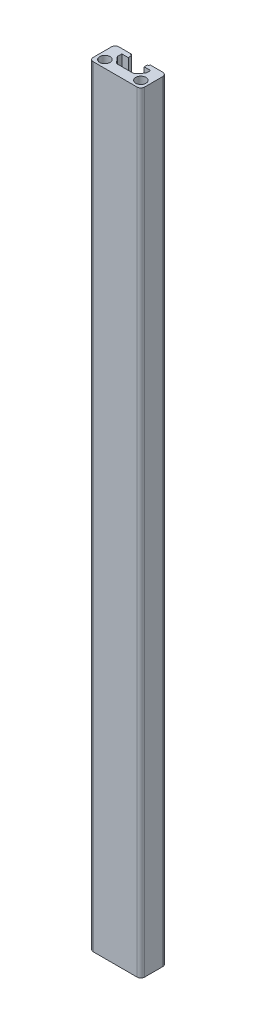
ISO-10303-21;
HEADER;
FILE_DESCRIPTION(('STEP AP214'),'2;1');
FILE_NAME('part.step','',(''),(''),'','','');
FILE_SCHEMA(('AUTOMOTIVE_DESIGN { 1 0 10303 214 1 1 1 1 }'));
ENDSEC;
DATA;
#1=APPLICATION_CONTEXT('core data for automotive mechanical design processes');
#2=APPLICATION_PROTOCOL_DEFINITION('international standard','automotive_design',2000,#1);
#3=PRODUCT_CONTEXT('',#1,'mechanical');
#4=PRODUCT('Part','Part','',(#3));
#5=PRODUCT_RELATED_PRODUCT_CATEGORY('part','',(#4));
#6=PRODUCT_DEFINITION_FORMATION('','',#4);
#7=PRODUCT_DEFINITION_CONTEXT('part definition',#1,'design');
#8=PRODUCT_DEFINITION('design','',#6,#7);
#9=PRODUCT_DEFINITION_SHAPE('','',#8);
#10=(LENGTH_UNIT() NAMED_UNIT(*) SI_UNIT(.MILLI.,.METRE.));
#11=(NAMED_UNIT(*) PLANE_ANGLE_UNIT() SI_UNIT($,.RADIAN.));
#12=(NAMED_UNIT(*) SI_UNIT($,.STERADIAN.) SOLID_ANGLE_UNIT());
#13=UNCERTAINTY_MEASURE_WITH_UNIT(LENGTH_MEASURE(1.E-05),#10,'distance_accuracy_value','');
#14=(GEOMETRIC_REPRESENTATION_CONTEXT(3) GLOBAL_UNCERTAINTY_ASSIGNED_CONTEXT((#13)) GLOBAL_UNIT_ASSIGNED_CONTEXT((#10,
#11,#12)) REPRESENTATION_CONTEXT('',''));
#15=CARTESIAN_POINT('',(0.,0.,0.));
#16=DIRECTION('',(0.,0.,1.));
#17=DIRECTION('',(1.,0.,0.));
#18=AXIS2_PLACEMENT_3D('',#15,#16,#17);
#19=CARTESIAN_POINT('',(0.,300.,0.));
#20=DIRECTION('',(0.,1.,0.));
#21=DIRECTION('',(0.,0.,1.));
#22=AXIS2_PLACEMENT_3D('',#19,#20,#21);
#23=PLANE('',#22);
#24=CARTESIAN_POINT('',(17.,300.,-3.));
#25=DIRECTION('',(0.,1.,0.));
#26=DIRECTION('',(0.,0.,1.));
#27=AXIS2_PLACEMENT_3D('',#24,#25,#26);
#28=CIRCLE('',#27,2.);
#29=CARTESIAN_POINT('',(17.,300.,-0.999999999999997));
#30=VERTEX_POINT('',#29);
#31=EDGE_CURVE('E241',#30,#30,#28,.T.);
#32=ORIENTED_EDGE('',*,*,#31,.F.);
#33=EDGE_LOOP('',(#32));
#34=FACE_BOUND('',#33,.T.);
#35=DIRECTION('',(-1.,0.,0.));
#36=VECTOR('',#35,1.);
#37=CARTESIAN_POINT('',(6.35,300.,-10.));
#38=LINE('',#37,#36);
#39=CARTESIAN_POINT('',(6.35,300.,-10.));
#40=VERTEX_POINT('',#39);
#41=CARTESIAN_POINT('',(1.5,300.,-10.));
#42=VERTEX_POINT('',#41);
#43=EDGE_CURVE('E234',#40,#42,#38,.T.);
#44=ORIENTED_EDGE('',*,*,#43,.T.);
#45=CARTESIAN_POINT('',(1.5,300.,-8.5));
#46=DIRECTION('',(0.,1.,0.));
#47=DIRECTION('',(0.,0.,1.));
#48=AXIS2_PLACEMENT_3D('',#45,#46,#47);
#49=CIRCLE('',#48,1.5);
#50=CARTESIAN_POINT('',(0.,300.,-8.5));
#51=VERTEX_POINT('',#50);
#52=EDGE_CURVE('E332',#42,#51,#49,.T.);
#53=ORIENTED_EDGE('',*,*,#52,.T.);
#54=DIRECTION('',(0.,0.,1.));
#55=VECTOR('',#54,1.);
#56=CARTESIAN_POINT('',(0.,300.,-10.));
#57=LINE('',#56,#55);
#58=CARTESIAN_POINT('',(0.,300.,-1.5));
#59=VERTEX_POINT('',#58);
#60=EDGE_CURVE('E276',#51,#59,#57,.T.);
#61=ORIENTED_EDGE('',*,*,#60,.T.);
#62=CARTESIAN_POINT('',(1.5,300.,-1.5));
#63=DIRECTION('',(0.,1.,0.));
#64=DIRECTION('',(0.,0.,1.));
#65=AXIS2_PLACEMENT_3D('',#62,#63,#64);
#66=CIRCLE('',#65,1.5);
#67=CARTESIAN_POINT('',(1.5,300.,0.));
#68=VERTEX_POINT('',#67);
#69=EDGE_CURVE('E330',#59,#68,#66,.T.);
#70=ORIENTED_EDGE('',*,*,#69,.T.);
#71=DIRECTION('',(1.,0.,0.));
#72=VECTOR('',#71,1.);
#73=CARTESIAN_POINT('',(0.,300.,0.));
#74=LINE('',#73,#72);
#75=CARTESIAN_POINT('',(18.5,300.,0.));
#76=VERTEX_POINT('',#75);
#77=EDGE_CURVE('E455',#68,#76,#74,.T.);
#78=ORIENTED_EDGE('',*,*,#77,.T.);
#79=CARTESIAN_POINT('',(18.5,300.,-1.5));
#80=DIRECTION('',(0.,1.,0.));
#81=DIRECTION('',(0.,0.,1.));
#82=AXIS2_PLACEMENT_3D('',#79,#80,#81);
#83=CIRCLE('',#82,1.5);
#84=CARTESIAN_POINT('',(20.,300.,-1.5));
#85=VERTEX_POINT('',#84);
#86=EDGE_CURVE('E327',#76,#85,#83,.T.);
#87=ORIENTED_EDGE('',*,*,#86,.T.);
#88=DIRECTION('',(0.,0.,-1.));
#89=VECTOR('',#88,1.);
#90=CARTESIAN_POINT('',(20.,300.,0.));
#91=LINE('',#90,#89);
#92=CARTESIAN_POINT('',(20.,300.,-8.5));
#93=VERTEX_POINT('',#92);
#94=EDGE_CURVE('E192',#85,#93,#91,.T.);
#95=ORIENTED_EDGE('',*,*,#94,.T.);
#96=CARTESIAN_POINT('',(18.5,300.,-8.5));
#97=DIRECTION('',(0.,1.,0.));
#98=DIRECTION('',(0.,0.,1.));
#99=AXIS2_PLACEMENT_3D('',#96,#97,#98);
#100=CIRCLE('',#99,1.5);
#101=CARTESIAN_POINT('',(18.5,300.,-10.));
#102=VERTEX_POINT('',#101);
#103=EDGE_CURVE('E51',#93,#102,#100,.T.);
#104=ORIENTED_EDGE('',*,*,#103,.T.);
#105=DIRECTION('',(-1.,0.,0.));
#106=VECTOR('',#105,1.);
#107=CARTESIAN_POINT('',(20.,300.,-10.));
#108=LINE('',#107,#106);
#109=CARTESIAN_POINT('',(13.65,300.,-10.));
#110=VERTEX_POINT('',#109);
#111=EDGE_CURVE('E182',#102,#110,#108,.T.);
#112=ORIENTED_EDGE('',*,*,#111,.T.);
#113=DIRECTION('',(0.,0.,1.));
#114=VECTOR('',#113,1.);
#115=CARTESIAN_POINT('',(13.65,300.,-9.51042760217637));
#116=LINE('',#115,#114);
#117=CARTESIAN_POINT('',(13.65,300.,-9.51042760217637));
#118=VERTEX_POINT('',#117);
#119=EDGE_CURVE('E187',#110,#118,#116,.T.);
#120=ORIENTED_EDGE('',*,*,#119,.T.);
#121=DIRECTION('',(-1.,0.,0.));
#122=VECTOR('',#121,1.);
#123=CARTESIAN_POINT('',(13.1,300.,-9.51042760217637));
#124=LINE('',#123,#122);
#125=CARTESIAN_POINT('',(13.1,300.,-9.51042760217637));
#126=VERTEX_POINT('',#125);
#127=EDGE_CURVE('E207',#118,#126,#124,.T.);
#128=ORIENTED_EDGE('',*,*,#127,.T.);
#129=DIRECTION('',(0.,0.,1.));
#130=VECTOR('',#129,1.);
#131=CARTESIAN_POINT('',(13.1,300.,-8.2));
#132=LINE('',#131,#130);
#133=CARTESIAN_POINT('',(13.1,300.,-8.2));
#134=VERTEX_POINT('',#133);
#135=EDGE_CURVE('E209',#126,#134,#132,.T.);
#136=ORIENTED_EDGE('',*,*,#135,.T.);
#137=DIRECTION('',(1.,0.,0.));
#138=VECTOR('',#137,1.);
#139=CARTESIAN_POINT('',(15.6,300.,-8.2));
#140=LINE('',#139,#138);
#141=CARTESIAN_POINT('',(15.6,300.,-8.2));
#142=VERTEX_POINT('',#141);
#143=EDGE_CURVE('E214',#134,#142,#140,.T.);
#144=ORIENTED_EDGE('',*,*,#143,.T.);
#145=DIRECTION('',(0.,0.,1.));
#146=VECTOR('',#145,1.);
#147=CARTESIAN_POINT('',(15.6,300.,-6.44750713590306));
#148=LINE('',#147,#146);
#149=CARTESIAN_POINT('',(15.6,300.,-6.44750713590306));
#150=VERTEX_POINT('',#149);
#151=EDGE_CURVE('E216',#142,#150,#148,.T.);
#152=ORIENTED_EDGE('',*,*,#151,.T.);
#153=DIRECTION('',(-0.651429062487269,0.,0.758709546893248));
#154=VECTOR('',#153,1.);
#155=CARTESIAN_POINT('',(13.4127068625717,300.,-3.9));
#156=LINE('',#155,#154);
#157=CARTESIAN_POINT('',(13.4127068625717,300.,-3.9));
#158=VERTEX_POINT('',#157);
#159=EDGE_CURVE('E218',#150,#158,#156,.T.);
#160=ORIENTED_EDGE('',*,*,#159,.T.);
#161=DIRECTION('',(-1.,0.,0.));
#162=VECTOR('',#161,1.);
#163=CARTESIAN_POINT('',(6.58729313742833,300.,-3.9));
#164=LINE('',#163,#162);
#165=CARTESIAN_POINT('',(6.58729313742833,300.,-3.9));
#166=VERTEX_POINT('',#165);
#167=EDGE_CURVE('E220',#158,#166,#164,.T.);
#168=ORIENTED_EDGE('',*,*,#167,.T.);
#169=DIRECTION('',(-0.651429062487269,0.,-0.758709546893248));
#170=VECTOR('',#169,1.);
#171=CARTESIAN_POINT('',(4.4,300.,-6.44750713590306));
#172=LINE('',#171,#170);
#173=CARTESIAN_POINT('',(4.4,300.,-6.44750713590306));
#174=VERTEX_POINT('',#173);
#175=EDGE_CURVE('E222',#166,#174,#172,.T.);
#176=ORIENTED_EDGE('',*,*,#175,.T.);
#177=DIRECTION('',(0.,0.,-1.));
#178=VECTOR('',#177,1.);
#179=CARTESIAN_POINT('',(4.4,300.,-8.2));
#180=LINE('',#179,#178);
#181=CARTESIAN_POINT('',(4.4,300.,-8.2));
#182=VERTEX_POINT('',#181);
#183=EDGE_CURVE('E224',#174,#182,#180,.T.);
#184=ORIENTED_EDGE('',*,*,#183,.T.);
#185=DIRECTION('',(1.,0.,0.));
#186=VECTOR('',#185,1.);
#187=CARTESIAN_POINT('',(6.9,300.,-8.2));
#188=LINE('',#187,#186);
#189=CARTESIAN_POINT('',(6.9,300.,-8.2));
#190=VERTEX_POINT('',#189);
#191=EDGE_CURVE('E226',#182,#190,#188,.T.);
#192=ORIENTED_EDGE('',*,*,#191,.T.);
#193=DIRECTION('',(0.,0.,-1.));
#194=VECTOR('',#193,1.);
#195=CARTESIAN_POINT('',(6.9,300.,-9.51042760217637));
#196=LINE('',#195,#194);
#197=CARTESIAN_POINT('',(6.9,300.,-9.51042760217637));
#198=VERTEX_POINT('',#197);
#199=EDGE_CURVE('E228',#190,#198,#196,.T.);
#200=ORIENTED_EDGE('',*,*,#199,.T.);
#201=DIRECTION('',(-1.,0.,0.));
#202=VECTOR('',#201,1.);
#203=CARTESIAN_POINT('',(6.35,300.,-9.51042760217637));
#204=LINE('',#203,#202);
#205=CARTESIAN_POINT('',(6.35,300.,-9.51042760217637));
#206=VERTEX_POINT('',#205);
#207=EDGE_CURVE('E230',#198,#206,#204,.T.);
#208=ORIENTED_EDGE('',*,*,#207,.T.);
#209=DIRECTION('',(0.,0.,-1.));
#210=VECTOR('',#209,1.);
#211=CARTESIAN_POINT('',(6.35,300.,-10.));
#212=LINE('',#211,#210);
#213=EDGE_CURVE('E232',#206,#40,#212,.T.);
#214=ORIENTED_EDGE('',*,*,#213,.T.);
#215=EDGE_LOOP('',(#44,#53,#61,#70,#78,#87,#95,#104,#112,#120,#128,#136,#144,#152,#160,#168,
#176,#184,#192,#200,#208,#214));
#216=FACE_BOUND('',#215,.T.);
#217=CARTESIAN_POINT('',(3.,300.,-3.));
#218=DIRECTION('',(0.,1.,0.));
#219=DIRECTION('',(0.,0.,1.));
#220=AXIS2_PLACEMENT_3D('',#217,#218,#219);
#221=CIRCLE('',#220,2.);
#222=CARTESIAN_POINT('',(3.,300.,-1.));
#223=VERTEX_POINT('',#222);
#224=EDGE_CURVE('E502',#223,#223,#221,.T.);
#225=ORIENTED_EDGE('',*,*,#224,.F.);
#226=EDGE_LOOP('',(#225));
#227=FACE_BOUND('',#226,.T.);
#228=ADVANCED_FACE('F36',(#34,#216,#227),#23,.T.);
#229=CARTESIAN_POINT('',(0.,0.,0.));
#230=DIRECTION('',(0.,1.,0.));
#231=DIRECTION('',(0.,0.,1.));
#232=AXIS2_PLACEMENT_3D('',#229,#230,#231);
#233=PLANE('',#232);
#234=DIRECTION('',(0.,0.,1.));
#235=VECTOR('',#234,1.);
#236=CARTESIAN_POINT('',(0.,0.,-10.));
#237=LINE('',#236,#235);
#238=CARTESIAN_POINT('',(0.,0.,-8.5));
#239=VERTEX_POINT('',#238);
#240=CARTESIAN_POINT('',(0.,0.,-1.5));
#241=VERTEX_POINT('',#240);
#242=EDGE_CURVE('E237',#239,#241,#237,.T.);
#243=ORIENTED_EDGE('',*,*,#242,.F.);
#244=CARTESIAN_POINT('',(1.5,0.,-8.5));
#245=DIRECTION('',(0.,1.,0.));
#246=DIRECTION('',(0.,0.,1.));
#247=AXIS2_PLACEMENT_3D('',#244,#245,#246);
#248=CIRCLE('',#247,1.5);
#249=CARTESIAN_POINT('',(1.5,0.,-10.));
#250=VERTEX_POINT('',#249);
#251=EDGE_CURVE('E323',#239,#250,#248,.F.);
#252=ORIENTED_EDGE('',*,*,#251,.T.);
#253=DIRECTION('',(-1.,0.,0.));
#254=VECTOR('',#253,1.);
#255=CARTESIAN_POINT('',(6.35,0.,-10.));
#256=LINE('',#255,#254);
#257=CARTESIAN_POINT('',(6.35,0.,-10.));
#258=VERTEX_POINT('',#257);
#259=EDGE_CURVE('E273',#258,#250,#256,.T.);
#260=ORIENTED_EDGE('',*,*,#259,.F.);
#261=DIRECTION('',(0.,0.,-1.));
#262=VECTOR('',#261,1.);
#263=CARTESIAN_POINT('',(6.35,0.,-10.));
#264=LINE('',#263,#262);
#265=CARTESIAN_POINT('',(6.35,0.,-9.51042760217637));
#266=VERTEX_POINT('',#265);
#267=EDGE_CURVE('E271',#266,#258,#264,.T.);
#268=ORIENTED_EDGE('',*,*,#267,.F.);
#269=DIRECTION('',(-1.,0.,0.));
#270=VECTOR('',#269,1.);
#271=CARTESIAN_POINT('',(6.35,0.,-9.51042760217637));
#272=LINE('',#271,#270);
#273=CARTESIAN_POINT('',(6.9,0.,-9.51042760217637));
#274=VERTEX_POINT('',#273);
#275=EDGE_CURVE('E269',#274,#266,#272,.T.);
#276=ORIENTED_EDGE('',*,*,#275,.F.);
#277=DIRECTION('',(0.,0.,-1.));
#278=VECTOR('',#277,1.);
#279=CARTESIAN_POINT('',(6.9,0.,-9.51042760217637));
#280=LINE('',#279,#278);
#281=CARTESIAN_POINT('',(6.9,0.,-8.2));
#282=VERTEX_POINT('',#281);
#283=EDGE_CURVE('E267',#282,#274,#280,.T.);
#284=ORIENTED_EDGE('',*,*,#283,.F.);
#285=DIRECTION('',(1.,0.,0.));
#286=VECTOR('',#285,1.);
#287=CARTESIAN_POINT('',(6.9,0.,-8.2));
#288=LINE('',#287,#286);
#289=CARTESIAN_POINT('',(4.4,0.,-8.2));
#290=VERTEX_POINT('',#289);
#291=EDGE_CURVE('E265',#290,#282,#288,.T.);
#292=ORIENTED_EDGE('',*,*,#291,.F.);
#293=DIRECTION('',(0.,0.,-1.));
#294=VECTOR('',#293,1.);
#295=CARTESIAN_POINT('',(4.4,0.,-8.2));
#296=LINE('',#295,#294);
#297=CARTESIAN_POINT('',(4.4,0.,-6.44750713590306));
#298=VERTEX_POINT('',#297);
#299=EDGE_CURVE('E263',#298,#290,#296,.T.);
#300=ORIENTED_EDGE('',*,*,#299,.F.);
#301=DIRECTION('',(-0.651429062487269,0.,-0.758709546893248));
#302=VECTOR('',#301,1.);
#303=CARTESIAN_POINT('',(4.4,0.,-6.44750713590306));
#304=LINE('',#303,#302);
#305=CARTESIAN_POINT('',(6.58729313742833,0.,-3.9));
#306=VERTEX_POINT('',#305);
#307=EDGE_CURVE('E261',#306,#298,#304,.T.);
#308=ORIENTED_EDGE('',*,*,#307,.F.);
#309=DIRECTION('',(-1.,0.,0.));
#310=VECTOR('',#309,1.);
#311=CARTESIAN_POINT('',(6.58729313742833,0.,-3.9));
#312=LINE('',#311,#310);
#313=CARTESIAN_POINT('',(13.4127068625717,0.,-3.9));
#314=VERTEX_POINT('',#313);
#315=EDGE_CURVE('E259',#314,#306,#312,.T.);
#316=ORIENTED_EDGE('',*,*,#315,.F.);
#317=DIRECTION('',(-0.651429062487269,0.,0.758709546893248));
#318=VECTOR('',#317,1.);
#319=CARTESIAN_POINT('',(13.4127068625717,0.,-3.9));
#320=LINE('',#319,#318);
#321=CARTESIAN_POINT('',(15.6,0.,-6.44750713590306));
#322=VERTEX_POINT('',#321);
#323=EDGE_CURVE('E257',#322,#314,#320,.T.);
#324=ORIENTED_EDGE('',*,*,#323,.F.);
#325=DIRECTION('',(0.,0.,1.));
#326=VECTOR('',#325,1.);
#327=CARTESIAN_POINT('',(15.6,0.,-6.44750713590306));
#328=LINE('',#327,#326);
#329=CARTESIAN_POINT('',(15.6,0.,-8.2));
#330=VERTEX_POINT('',#329);
#331=EDGE_CURVE('E255',#330,#322,#328,.T.);
#332=ORIENTED_EDGE('',*,*,#331,.F.);
#333=DIRECTION('',(1.,0.,0.));
#334=VECTOR('',#333,1.);
#335=CARTESIAN_POINT('',(15.6,0.,-8.2));
#336=LINE('',#335,#334);
#337=CARTESIAN_POINT('',(13.1,0.,-8.2));
#338=VERTEX_POINT('',#337);
#339=EDGE_CURVE('E253',#338,#330,#336,.T.);
#340=ORIENTED_EDGE('',*,*,#339,.F.);
#341=DIRECTION('',(0.,0.,1.));
#342=VECTOR('',#341,1.);
#343=CARTESIAN_POINT('',(13.1,0.,-8.2));
#344=LINE('',#343,#342);
#345=CARTESIAN_POINT('',(13.1,0.,-9.51042760217637));
#346=VERTEX_POINT('',#345);
#347=EDGE_CURVE('E251',#346,#338,#344,.T.);
#348=ORIENTED_EDGE('',*,*,#347,.F.);
#349=DIRECTION('',(-1.,0.,0.));
#350=VECTOR('',#349,1.);
#351=CARTESIAN_POINT('',(13.1,0.,-9.51042760217637));
#352=LINE('',#351,#350);
#353=CARTESIAN_POINT('',(13.65,0.,-9.51042760217637));
#354=VERTEX_POINT('',#353);
#355=EDGE_CURVE('E249',#354,#346,#352,.T.);
#356=ORIENTED_EDGE('',*,*,#355,.F.);
#357=DIRECTION('',(0.,0.,1.));
#358=VECTOR('',#357,1.);
#359=CARTESIAN_POINT('',(13.65,0.,-9.51042760217637));
#360=LINE('',#359,#358);
#361=CARTESIAN_POINT('',(13.65,0.,-10.));
#362=VERTEX_POINT('',#361);
#363=EDGE_CURVE('E247',#362,#354,#360,.T.);
#364=ORIENTED_EDGE('',*,*,#363,.F.);
#365=DIRECTION('',(-1.,0.,0.));
#366=VECTOR('',#365,1.);
#367=CARTESIAN_POINT('',(20.,0.,-10.));
#368=LINE('',#367,#366);
#369=CARTESIAN_POINT('',(18.5,0.,-10.));
#370=VERTEX_POINT('',#369);
#371=EDGE_CURVE('E198',#370,#362,#368,.T.);
#372=ORIENTED_EDGE('',*,*,#371,.F.);
#373=CARTESIAN_POINT('',(18.5,0.,-8.5));
#374=DIRECTION('',(0.,1.,0.));
#375=DIRECTION('',(0.,0.,1.));
#376=AXIS2_PLACEMENT_3D('',#373,#374,#375);
#377=CIRCLE('',#376,1.5);
#378=CARTESIAN_POINT('',(20.,0.,-8.5));
#379=VERTEX_POINT('',#378);
#380=EDGE_CURVE('E319',#370,#379,#377,.F.);
#381=ORIENTED_EDGE('',*,*,#380,.T.);
#382=DIRECTION('',(0.,0.,-1.));
#383=VECTOR('',#382,1.);
#384=CARTESIAN_POINT('',(20.,0.,0.));
#385=LINE('',#384,#383);
#386=CARTESIAN_POINT('',(20.,0.,-1.5));
#387=VERTEX_POINT('',#386);
#388=EDGE_CURVE('E244',#387,#379,#385,.T.);
#389=ORIENTED_EDGE('',*,*,#388,.F.);
#390=CARTESIAN_POINT('',(18.5,0.,-1.5));
#391=DIRECTION('',(0.,1.,0.));
#392=DIRECTION('',(0.,0.,1.));
#393=AXIS2_PLACEMENT_3D('',#390,#391,#392);
#394=CIRCLE('',#393,1.5);
#395=CARTESIAN_POINT('',(18.5,0.,0.));
#396=VERTEX_POINT('',#395);
#397=EDGE_CURVE('E317',#387,#396,#394,.F.);
#398=ORIENTED_EDGE('',*,*,#397,.T.);
#399=DIRECTION('',(1.,0.,0.));
#400=VECTOR('',#399,1.);
#401=CARTESIAN_POINT('',(0.,0.,0.));
#402=LINE('',#401,#400);
#403=CARTESIAN_POINT('',(1.5,0.,0.));
#404=VERTEX_POINT('',#403);
#405=EDGE_CURVE('E240',#404,#396,#402,.T.);
#406=ORIENTED_EDGE('',*,*,#405,.F.);
#407=CARTESIAN_POINT('',(1.5,0.,-1.5));
#408=DIRECTION('',(0.,1.,0.));
#409=DIRECTION('',(0.,0.,1.));
#410=AXIS2_PLACEMENT_3D('',#407,#408,#409);
#411=CIRCLE('',#410,1.5);
#412=EDGE_CURVE('E321',#404,#241,#411,.F.);
#413=ORIENTED_EDGE('',*,*,#412,.T.);
#414=EDGE_LOOP('',(#243,#252,#260,#268,#276,#284,#292,#300,#308,#316,#324,#332,#340,#348,#356,
#364,#372,#381,#389,#398,#406,#413));
#415=FACE_BOUND('',#414,.T.);
#416=CARTESIAN_POINT('',(17.,0.,-3.));
#417=DIRECTION('',(0.,1.,0.));
#418=DIRECTION('',(0.,0.,1.));
#419=AXIS2_PLACEMENT_3D('',#416,#417,#418);
#420=CIRCLE('',#419,2.);
#421=CARTESIAN_POINT('',(17.,0.,-0.999999999999997));
#422=VERTEX_POINT('',#421);
#423=EDGE_CURVE('E460',#422,#422,#420,.T.);
#424=ORIENTED_EDGE('',*,*,#423,.T.);
#425=EDGE_LOOP('',(#424));
#426=FACE_BOUND('',#425,.T.);
#427=CARTESIAN_POINT('',(3.,0.,-3.));
#428=DIRECTION('',(0.,1.,0.));
#429=DIRECTION('',(0.,0.,1.));
#430=AXIS2_PLACEMENT_3D('',#427,#428,#429);
#431=CIRCLE('',#430,2.);
#432=CARTESIAN_POINT('',(3.,0.,-1.));
#433=VERTEX_POINT('',#432);
#434=EDGE_CURVE('E505',#433,#433,#431,.T.);
#435=ORIENTED_EDGE('',*,*,#434,.T.);
#436=EDGE_LOOP('',(#435));
#437=FACE_BOUND('',#436,.T.);
#438=ADVANCED_FACE('F348',(#415,#426,#437),#233,.F.);
#439=CARTESIAN_POINT('',(0.,300.,-10.));
#440=DIRECTION('',(1.,0.,0.));
#441=DIRECTION('',(0.,0.,-1.));
#442=AXIS2_PLACEMENT_3D('',#439,#440,#441);
#443=PLANE('',#442);
#444=ORIENTED_EDGE('',*,*,#60,.F.);
#445=DIRECTION('',(0.,-1.,0.));
#446=VECTOR('',#445,1.);
#447=CARTESIAN_POINT('',(0.,300.,-8.5));
#448=LINE('',#447,#446);
#449=EDGE_CURVE('E314',#51,#239,#448,.T.);
#450=ORIENTED_EDGE('',*,*,#449,.T.);
#451=ORIENTED_EDGE('',*,*,#242,.T.);
#452=DIRECTION('',(0.,-1.,0.));
#453=VECTOR('',#452,1.);
#454=CARTESIAN_POINT('',(0.,300.,-1.5));
#455=LINE('',#454,#453);
#456=EDGE_CURVE('E201',#241,#59,#455,.F.);
#457=ORIENTED_EDGE('',*,*,#456,.T.);
#458=EDGE_LOOP('',(#444,#450,#451,#457));
#459=FACE_BOUND('',#458,.T.);
#460=ADVANCED_FACE('F368',(#459),#443,.F.);
#461=CARTESIAN_POINT('',(0.,300.,0.));
#462=DIRECTION('',(0.,0.,-1.));
#463=DIRECTION('',(-1.,0.,0.));
#464=AXIS2_PLACEMENT_3D('',#461,#462,#463);
#465=PLANE('',#464);
#466=ORIENTED_EDGE('',*,*,#77,.F.);
#467=DIRECTION('',(0.,-1.,0.));
#468=VECTOR('',#467,1.);
#469=CARTESIAN_POINT('',(1.5,300.,0.));
#470=LINE('',#469,#468);
#471=EDGE_CURVE('E336',#68,#404,#470,.T.);
#472=ORIENTED_EDGE('',*,*,#471,.T.);
#473=ORIENTED_EDGE('',*,*,#405,.T.);
#474=DIRECTION('',(0.,-1.,0.));
#475=VECTOR('',#474,1.);
#476=CARTESIAN_POINT('',(18.5,300.,0.));
#477=LINE('',#476,#475);
#478=EDGE_CURVE('E334',#396,#76,#477,.F.);
#479=ORIENTED_EDGE('',*,*,#478,.T.);
#480=EDGE_LOOP('',(#466,#472,#473,#479));
#481=FACE_BOUND('',#480,.T.);
#482=ADVANCED_FACE('F433',(#481),#465,.F.);
#483=CARTESIAN_POINT('',(20.,300.,0.));
#484=DIRECTION('',(-1.,0.,0.));
#485=DIRECTION('',(0.,0.,1.));
#486=AXIS2_PLACEMENT_3D('',#483,#484,#485);
#487=PLANE('',#486);
#488=ORIENTED_EDGE('',*,*,#388,.T.);
#489=DIRECTION('',(0.,-1.,0.));
#490=VECTOR('',#489,1.);
#491=CARTESIAN_POINT('',(20.,300.,-8.5));
#492=LINE('',#491,#490);
#493=EDGE_CURVE('E11',#379,#93,#492,.F.);
#494=ORIENTED_EDGE('',*,*,#493,.T.);
#495=ORIENTED_EDGE('',*,*,#94,.F.);
#496=DIRECTION('',(0.,-1.,0.));
#497=VECTOR('',#496,1.);
#498=CARTESIAN_POINT('',(20.,300.,-1.5));
#499=LINE('',#498,#497);
#500=EDGE_CURVE('E44',#85,#387,#499,.T.);
#501=ORIENTED_EDGE('',*,*,#500,.T.);
#502=EDGE_LOOP('',(#488,#494,#495,#501));
#503=FACE_BOUND('',#502,.T.);
#504=ADVANCED_FACE('F343',(#503),#487,.F.);
#505=CARTESIAN_POINT('',(20.,300.,-10.));
#506=DIRECTION('',(0.,0.,1.));
#507=DIRECTION('',(1.,0.,0.));
#508=AXIS2_PLACEMENT_3D('',#505,#506,#507);
#509=PLANE('',#508);
#510=ORIENTED_EDGE('',*,*,#111,.F.);
#511=DIRECTION('',(0.,-1.,0.));
#512=VECTOR('',#511,1.);
#513=CARTESIAN_POINT('',(18.5,300.,-10.));
#514=LINE('',#513,#512);
#515=EDGE_CURVE('E339',#102,#370,#514,.T.);
#516=ORIENTED_EDGE('',*,*,#515,.T.);
#517=ORIENTED_EDGE('',*,*,#371,.T.);
#518=DIRECTION('',(0.,-1.,0.));
#519=VECTOR('',#518,1.);
#520=CARTESIAN_POINT('',(13.65,300.,-10.));
#521=LINE('',#520,#519);
#522=EDGE_CURVE('E195',#110,#362,#521,.T.);
#523=ORIENTED_EDGE('',*,*,#522,.F.);
#524=EDGE_LOOP('',(#510,#516,#517,#523));
#525=FACE_BOUND('',#524,.T.);
#526=ADVANCED_FACE('F196',(#525),#509,.F.);
#527=CARTESIAN_POINT('',(13.65,300.,-9.51042760217637));
#528=DIRECTION('',(1.,0.,0.));
#529=DIRECTION('',(0.,0.,-1.));
#530=AXIS2_PLACEMENT_3D('',#527,#528,#529);
#531=PLANE('',#530);
#532=ORIENTED_EDGE('',*,*,#363,.T.);
#533=DIRECTION('',(0.,-1.,0.));
#534=VECTOR('',#533,1.);
#535=CARTESIAN_POINT('',(13.65,300.,-9.51042760217637));
#536=LINE('',#535,#534);
#537=EDGE_CURVE('E202',#118,#354,#536,.T.);
#538=ORIENTED_EDGE('',*,*,#537,.F.);
#539=ORIENTED_EDGE('',*,*,#119,.F.);
#540=ORIENTED_EDGE('',*,*,#522,.T.);
#541=EDGE_LOOP('',(#532,#538,#539,#540));
#542=FACE_BOUND('',#541,.T.);
#543=ADVANCED_FACE('F204',(#542),#531,.F.);
#544=CARTESIAN_POINT('',(13.1,300.,-9.51042760217637));
#545=DIRECTION('',(0.,0.,1.));
#546=DIRECTION('',(1.,0.,0.));
#547=AXIS2_PLACEMENT_3D('',#544,#545,#546);
#548=PLANE('',#547);
#549=ORIENTED_EDGE('',*,*,#355,.T.);
#550=DIRECTION('',(0.,-1.,0.));
#551=VECTOR('',#550,1.);
#552=CARTESIAN_POINT('',(13.1,300.,-9.51042760217637));
#553=LINE('',#552,#551);
#554=EDGE_CURVE('E309',#126,#346,#553,.T.);
#555=ORIENTED_EDGE('',*,*,#554,.F.);
#556=ORIENTED_EDGE('',*,*,#127,.F.);
#557=ORIENTED_EDGE('',*,*,#537,.T.);
#558=EDGE_LOOP('',(#549,#555,#556,#557));
#559=FACE_BOUND('',#558,.T.);
#560=ADVANCED_FACE('F422',(#559),#548,.F.);
#561=CARTESIAN_POINT('',(13.1,300.,-8.2));
#562=DIRECTION('',(1.,0.,0.));
#563=DIRECTION('',(0.,0.,-1.));
#564=AXIS2_PLACEMENT_3D('',#561,#562,#563);
#565=PLANE('',#564);
#566=ORIENTED_EDGE('',*,*,#347,.T.);
#567=DIRECTION('',(0.,-1.,0.));
#568=VECTOR('',#567,1.);
#569=CARTESIAN_POINT('',(13.1,300.,-8.2));
#570=LINE('',#569,#568);
#571=EDGE_CURVE('E306',#134,#338,#570,.T.);
#572=ORIENTED_EDGE('',*,*,#571,.F.);
#573=ORIENTED_EDGE('',*,*,#135,.F.);
#574=ORIENTED_EDGE('',*,*,#554,.T.);
#575=EDGE_LOOP('',(#566,#572,#573,#574));
#576=FACE_BOUND('',#575,.T.);
#577=ADVANCED_FACE('F418',(#576),#565,.F.);
#578=CARTESIAN_POINT('',(15.6,300.,-8.2));
#579=DIRECTION('',(0.,0.,-1.));
#580=DIRECTION('',(-1.,0.,0.));
#581=AXIS2_PLACEMENT_3D('',#578,#579,#580);
#582=PLANE('',#581);
#583=ORIENTED_EDGE('',*,*,#339,.T.);
#584=DIRECTION('',(0.,-1.,0.));
#585=VECTOR('',#584,1.);
#586=CARTESIAN_POINT('',(15.6,300.,-8.2));
#587=LINE('',#586,#585);
#588=EDGE_CURVE('E303',#142,#330,#587,.T.);
#589=ORIENTED_EDGE('',*,*,#588,.F.);
#590=ORIENTED_EDGE('',*,*,#143,.F.);
#591=ORIENTED_EDGE('',*,*,#571,.T.);
#592=EDGE_LOOP('',(#583,#589,#590,#591));
#593=FACE_BOUND('',#592,.T.);
#594=ADVANCED_FACE('F414',(#593),#582,.F.);
#595=CARTESIAN_POINT('',(15.6,300.,-6.44750713590306));
#596=DIRECTION('',(1.,0.,0.));
#597=DIRECTION('',(0.,0.,-1.));
#598=AXIS2_PLACEMENT_3D('',#595,#596,#597);
#599=PLANE('',#598);
#600=ORIENTED_EDGE('',*,*,#331,.T.);
#601=DIRECTION('',(0.,-1.,0.));
#602=VECTOR('',#601,1.);
#603=CARTESIAN_POINT('',(15.6,300.,-6.44750713590306));
#604=LINE('',#603,#602);
#605=EDGE_CURVE('E300',#150,#322,#604,.T.);
#606=ORIENTED_EDGE('',*,*,#605,.F.);
#607=ORIENTED_EDGE('',*,*,#151,.F.);
#608=ORIENTED_EDGE('',*,*,#588,.T.);
#609=EDGE_LOOP('',(#600,#606,#607,#608));
#610=FACE_BOUND('',#609,.T.);
#611=ADVANCED_FACE('F410',(#610),#599,.F.);
#612=CARTESIAN_POINT('',(13.4127068625717,300.,-3.9));
#613=DIRECTION('',(0.758709546893248,0.,0.651429062487269));
#614=DIRECTION('',(0.651429062487269,0.,-0.758709546893248));
#615=AXIS2_PLACEMENT_3D('',#612,#613,#614);
#616=PLANE('',#615);
#617=ORIENTED_EDGE('',*,*,#323,.T.);
#618=DIRECTION('',(0.,-1.,0.));
#619=VECTOR('',#618,1.);
#620=CARTESIAN_POINT('',(13.4127068625717,300.,-3.9));
#621=LINE('',#620,#619);
#622=EDGE_CURVE('E297',#158,#314,#621,.T.);
#623=ORIENTED_EDGE('',*,*,#622,.F.);
#624=ORIENTED_EDGE('',*,*,#159,.F.);
#625=ORIENTED_EDGE('',*,*,#605,.T.);
#626=EDGE_LOOP('',(#617,#623,#624,#625));
#627=FACE_BOUND('',#626,.T.);
#628=ADVANCED_FACE('F406',(#627),#616,.F.);
#629=CARTESIAN_POINT('',(6.58729313742833,300.,-3.9));
#630=DIRECTION('',(0.,0.,1.));
#631=DIRECTION('',(1.,0.,0.));
#632=AXIS2_PLACEMENT_3D('',#629,#630,#631);
#633=PLANE('',#632);
#634=ORIENTED_EDGE('',*,*,#315,.T.);
#635=DIRECTION('',(0.,-1.,0.));
#636=VECTOR('',#635,1.);
#637=CARTESIAN_POINT('',(6.58729313742833,300.,-3.9));
#638=LINE('',#637,#636);
#639=EDGE_CURVE('E294',#166,#306,#638,.T.);
#640=ORIENTED_EDGE('',*,*,#639,.F.);
#641=ORIENTED_EDGE('',*,*,#167,.F.);
#642=ORIENTED_EDGE('',*,*,#622,.T.);
#643=EDGE_LOOP('',(#634,#640,#641,#642));
#644=FACE_BOUND('',#643,.T.);
#645=ADVANCED_FACE('F402',(#644),#633,.F.);
#646=CARTESIAN_POINT('',(4.4,300.,-6.44750713590306));
#647=DIRECTION('',(-0.758709546893248,0.,0.651429062487269));
#648=DIRECTION('',(0.651429062487269,0.,0.758709546893248));
#649=AXIS2_PLACEMENT_3D('',#646,#647,#648);
#650=PLANE('',#649);
#651=ORIENTED_EDGE('',*,*,#307,.T.);
#652=DIRECTION('',(0.,-1.,0.));
#653=VECTOR('',#652,1.);
#654=CARTESIAN_POINT('',(4.4,300.,-6.44750713590306));
#655=LINE('',#654,#653);
#656=EDGE_CURVE('E291',#174,#298,#655,.T.);
#657=ORIENTED_EDGE('',*,*,#656,.F.);
#658=ORIENTED_EDGE('',*,*,#175,.F.);
#659=ORIENTED_EDGE('',*,*,#639,.T.);
#660=EDGE_LOOP('',(#651,#657,#658,#659));
#661=FACE_BOUND('',#660,.T.);
#662=ADVANCED_FACE('F398',(#661),#650,.F.);
#663=CARTESIAN_POINT('',(4.4,300.,-8.2));
#664=DIRECTION('',(-1.,0.,0.));
#665=DIRECTION('',(0.,0.,1.));
#666=AXIS2_PLACEMENT_3D('',#663,#664,#665);
#667=PLANE('',#666);
#668=ORIENTED_EDGE('',*,*,#299,.T.);
#669=DIRECTION('',(0.,-1.,0.));
#670=VECTOR('',#669,1.);
#671=CARTESIAN_POINT('',(4.4,300.,-8.2));
#672=LINE('',#671,#670);
#673=EDGE_CURVE('E288',#182,#290,#672,.T.);
#674=ORIENTED_EDGE('',*,*,#673,.F.);
#675=ORIENTED_EDGE('',*,*,#183,.F.);
#676=ORIENTED_EDGE('',*,*,#656,.T.);
#677=EDGE_LOOP('',(#668,#674,#675,#676));
#678=FACE_BOUND('',#677,.T.);
#679=ADVANCED_FACE('F394',(#678),#667,.F.);
#680=CARTESIAN_POINT('',(6.9,300.,-8.2));
#681=DIRECTION('',(0.,0.,-1.));
#682=DIRECTION('',(-1.,0.,0.));
#683=AXIS2_PLACEMENT_3D('',#680,#681,#682);
#684=PLANE('',#683);
#685=ORIENTED_EDGE('',*,*,#291,.T.);
#686=DIRECTION('',(0.,-1.,0.));
#687=VECTOR('',#686,1.);
#688=CARTESIAN_POINT('',(6.9,300.,-8.2));
#689=LINE('',#688,#687);
#690=EDGE_CURVE('E285',#190,#282,#689,.T.);
#691=ORIENTED_EDGE('',*,*,#690,.F.);
#692=ORIENTED_EDGE('',*,*,#191,.F.);
#693=ORIENTED_EDGE('',*,*,#673,.T.);
#694=EDGE_LOOP('',(#685,#691,#692,#693));
#695=FACE_BOUND('',#694,.T.);
#696=ADVANCED_FACE('F390',(#695),#684,.F.);
#697=CARTESIAN_POINT('',(6.9,300.,-9.51042760217637));
#698=DIRECTION('',(-1.,0.,0.));
#699=DIRECTION('',(0.,0.,1.));
#700=AXIS2_PLACEMENT_3D('',#697,#698,#699);
#701=PLANE('',#700);
#702=ORIENTED_EDGE('',*,*,#283,.T.);
#703=DIRECTION('',(0.,-1.,0.));
#704=VECTOR('',#703,1.);
#705=CARTESIAN_POINT('',(6.9,300.,-9.51042760217637));
#706=LINE('',#705,#704);
#707=EDGE_CURVE('E282',#198,#274,#706,.T.);
#708=ORIENTED_EDGE('',*,*,#707,.F.);
#709=ORIENTED_EDGE('',*,*,#199,.F.);
#710=ORIENTED_EDGE('',*,*,#690,.T.);
#711=EDGE_LOOP('',(#702,#708,#709,#710));
#712=FACE_BOUND('',#711,.T.);
#713=ADVANCED_FACE('F386',(#712),#701,.F.);
#714=CARTESIAN_POINT('',(6.35,300.,-9.51042760217637));
#715=DIRECTION('',(0.,0.,1.));
#716=DIRECTION('',(1.,0.,0.));
#717=AXIS2_PLACEMENT_3D('',#714,#715,#716);
#718=PLANE('',#717);
#719=ORIENTED_EDGE('',*,*,#275,.T.);
#720=DIRECTION('',(0.,-1.,0.));
#721=VECTOR('',#720,1.);
#722=CARTESIAN_POINT('',(6.35,300.,-9.51042760217637));
#723=LINE('',#722,#721);
#724=EDGE_CURVE('E279',#206,#266,#723,.T.);
#725=ORIENTED_EDGE('',*,*,#724,.F.);
#726=ORIENTED_EDGE('',*,*,#207,.F.);
#727=ORIENTED_EDGE('',*,*,#707,.T.);
#728=EDGE_LOOP('',(#719,#725,#726,#727));
#729=FACE_BOUND('',#728,.T.);
#730=ADVANCED_FACE('F382',(#729),#718,.F.);
#731=CARTESIAN_POINT('',(6.35,300.,-10.));
#732=DIRECTION('',(-1.,0.,0.));
#733=DIRECTION('',(0.,0.,1.));
#734=AXIS2_PLACEMENT_3D('',#731,#732,#733);
#735=PLANE('',#734);
#736=ORIENTED_EDGE('',*,*,#267,.T.);
#737=DIRECTION('',(0.,-1.,0.));
#738=VECTOR('',#737,1.);
#739=CARTESIAN_POINT('',(6.35,300.,-10.));
#740=LINE('',#739,#738);
#741=EDGE_CURVE('E236',#40,#258,#740,.T.);
#742=ORIENTED_EDGE('',*,*,#741,.F.);
#743=ORIENTED_EDGE('',*,*,#213,.F.);
#744=ORIENTED_EDGE('',*,*,#724,.T.);
#745=EDGE_LOOP('',(#736,#742,#743,#744));
#746=FACE_BOUND('',#745,.T.);
#747=ADVANCED_FACE('F378',(#746),#735,.F.);
#748=CARTESIAN_POINT('',(6.35,300.,-10.));
#749=DIRECTION('',(0.,0.,1.));
#750=DIRECTION('',(1.,0.,0.));
#751=AXIS2_PLACEMENT_3D('',#748,#749,#750);
#752=PLANE('',#751);
#753=ORIENTED_EDGE('',*,*,#259,.T.);
#754=DIRECTION('',(0.,-1.,0.));
#755=VECTOR('',#754,1.);
#756=CARTESIAN_POINT('',(1.5,300.,-10.));
#757=LINE('',#756,#755);
#758=EDGE_CURVE('E325',#250,#42,#757,.F.);
#759=ORIENTED_EDGE('',*,*,#758,.T.);
#760=ORIENTED_EDGE('',*,*,#43,.F.);
#761=ORIENTED_EDGE('',*,*,#741,.T.);
#762=EDGE_LOOP('',(#753,#759,#760,#761));
#763=FACE_BOUND('',#762,.T.);
#764=ADVANCED_FACE('F375',(#763),#752,.F.);
#765=CARTESIAN_POINT('',(17.,300.,-3.));
#766=DIRECTION('',(0.,-1.,0.));
#767=DIRECTION('',(0.,0.,-1.));
#768=AXIS2_PLACEMENT_3D('',#765,#766,#767);
#769=CYLINDRICAL_SURFACE('',#768,2.);
#770=ORIENTED_EDGE('',*,*,#31,.T.);
#771=EDGE_LOOP('',(#770));
#772=FACE_BOUND('',#771,.T.);
#773=ORIENTED_EDGE('',*,*,#423,.F.);
#774=EDGE_LOOP('',(#773));
#775=FACE_BOUND('',#774,.T.);
#776=ADVANCED_FACE('F372',(#772,#775),#769,.F.);
#777=CARTESIAN_POINT('',(3.,300.,-3.));
#778=DIRECTION('',(0.,-1.,0.));
#779=DIRECTION('',(0.,0.,-1.));
#780=AXIS2_PLACEMENT_3D('',#777,#778,#779);
#781=CYLINDRICAL_SURFACE('',#780,2.);
#782=ORIENTED_EDGE('',*,*,#224,.T.);
#783=EDGE_LOOP('',(#782));
#784=FACE_BOUND('',#783,.T.);
#785=ORIENTED_EDGE('',*,*,#434,.F.);
#786=EDGE_LOOP('',(#785));
#787=FACE_BOUND('',#786,.T.);
#788=ADVANCED_FACE('F441',(#784,#787),#781,.F.);
#789=CARTESIAN_POINT('',(1.5,300.,-8.5));
#790=DIRECTION('',(0.,-1.,0.));
#791=DIRECTION('',(0.,0.,-1.));
#792=AXIS2_PLACEMENT_3D('',#789,#790,#791);
#793=CYLINDRICAL_SURFACE('',#792,1.5);
#794=ORIENTED_EDGE('',*,*,#52,.F.);
#795=ORIENTED_EDGE('',*,*,#758,.F.);
#796=ORIENTED_EDGE('',*,*,#251,.F.);
#797=ORIENTED_EDGE('',*,*,#449,.F.);
#798=EDGE_LOOP('',(#794,#795,#796,#797));
#799=FACE_BOUND('',#798,.T.);
#800=ADVANCED_FACE('F359',(#799),#793,.T.);
#801=CARTESIAN_POINT('',(1.5,300.,-1.5));
#802=DIRECTION('',(0.,-1.,0.));
#803=DIRECTION('',(0.,0.,-1.));
#804=AXIS2_PLACEMENT_3D('',#801,#802,#803);
#805=CYLINDRICAL_SURFACE('',#804,1.5);
#806=ORIENTED_EDGE('',*,*,#69,.F.);
#807=ORIENTED_EDGE('',*,*,#456,.F.);
#808=ORIENTED_EDGE('',*,*,#412,.F.);
#809=ORIENTED_EDGE('',*,*,#471,.F.);
#810=EDGE_LOOP('',(#806,#807,#808,#809));
#811=FACE_BOUND('',#810,.T.);
#812=ADVANCED_FACE('F354',(#811),#805,.T.);
#813=CARTESIAN_POINT('',(18.5,300.,-8.5));
#814=DIRECTION('',(0.,-1.,0.));
#815=DIRECTION('',(0.,0.,-1.));
#816=AXIS2_PLACEMENT_3D('',#813,#814,#815);
#817=CYLINDRICAL_SURFACE('',#816,1.5);
#818=ORIENTED_EDGE('',*,*,#103,.F.);
#819=ORIENTED_EDGE('',*,*,#493,.F.);
#820=ORIENTED_EDGE('',*,*,#380,.F.);
#821=ORIENTED_EDGE('',*,*,#515,.F.);
#822=EDGE_LOOP('',(#818,#819,#820,#821));
#823=FACE_BOUND('',#822,.T.);
#824=ADVANCED_FACE('F352',(#823),#817,.T.);
#825=CARTESIAN_POINT('',(18.5,300.,-1.5));
#826=DIRECTION('',(0.,-1.,0.));
#827=DIRECTION('',(0.,0.,-1.));
#828=AXIS2_PLACEMENT_3D('',#825,#826,#827);
#829=CYLINDRICAL_SURFACE('',#828,1.5);
#830=ORIENTED_EDGE('',*,*,#86,.F.);
#831=ORIENTED_EDGE('',*,*,#478,.F.);
#832=ORIENTED_EDGE('',*,*,#397,.F.);
#833=ORIENTED_EDGE('',*,*,#500,.F.);
#834=EDGE_LOOP('',(#830,#831,#832,#833));
#835=FACE_BOUND('',#834,.T.);
#836=ADVANCED_FACE('F38',(#835),#829,.T.);
#837=CLOSED_SHELL('',(#228,#438,#460,#482,#504,#526,#543,#560,#577,#594,#611,#628,#645,#662,
#679,#696,#713,#730,#747,#764,#776,#788,#800,#812,#824,#836));
#838=MANIFOLD_SOLID_BREP('B2',#837);
#839=ADVANCED_BREP_SHAPE_REPRESENTATION('',(#18,#838),#14);
#840=SHAPE_DEFINITION_REPRESENTATION(#9,#839);
ENDSEC;
END-ISO-10303-21;
